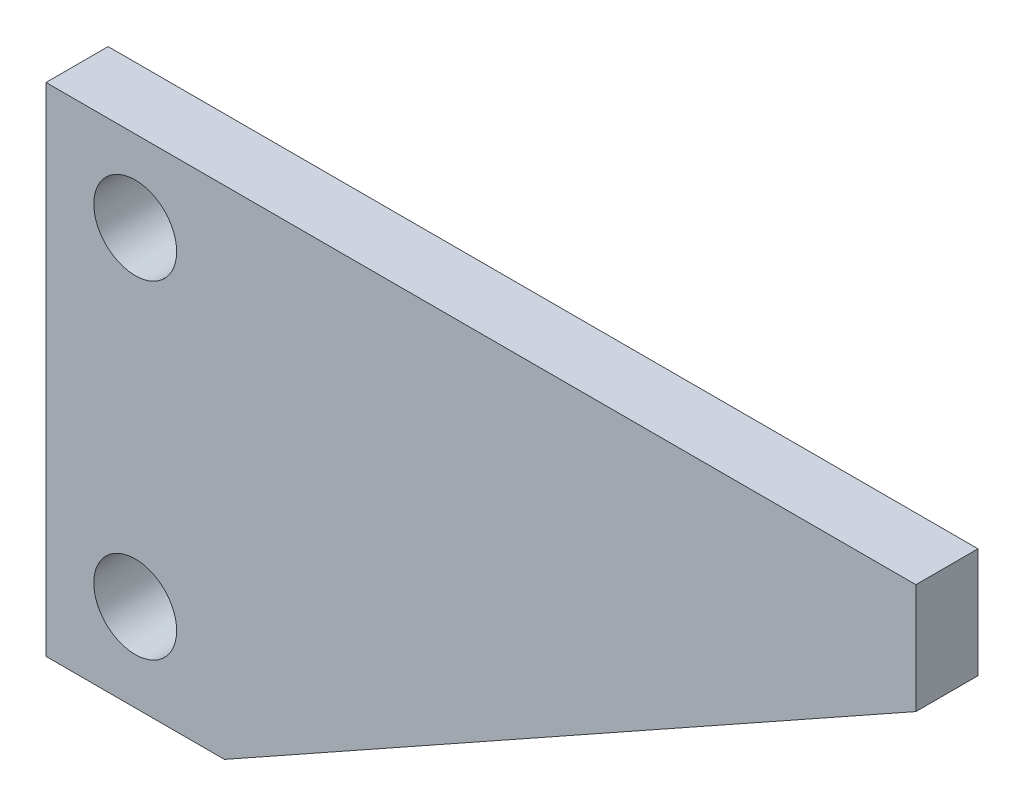
ISO-10303-21;
HEADER;
FILE_DESCRIPTION(('STEP AP214'),'2;1');
FILE_NAME('part.step','',(''),(''),'','','');
FILE_SCHEMA(('AUTOMOTIVE_DESIGN { 1 0 10303 214 1 1 1 1 }'));
ENDSEC;
DATA;
#1=APPLICATION_CONTEXT('core data for automotive mechanical design processes');
#2=APPLICATION_PROTOCOL_DEFINITION('international standard','automotive_design',2000,#1);
#3=PRODUCT_CONTEXT('',#1,'mechanical');
#4=PRODUCT('Part','Part','',(#3));
#5=PRODUCT_RELATED_PRODUCT_CATEGORY('part','',(#4));
#6=PRODUCT_DEFINITION_FORMATION('','',#4);
#7=PRODUCT_DEFINITION_CONTEXT('part definition',#1,'design');
#8=PRODUCT_DEFINITION('design','',#6,#7);
#9=PRODUCT_DEFINITION_SHAPE('','',#8);
#10=(LENGTH_UNIT() NAMED_UNIT(*) SI_UNIT(.MILLI.,.METRE.));
#11=(NAMED_UNIT(*) PLANE_ANGLE_UNIT() SI_UNIT($,.RADIAN.));
#12=(NAMED_UNIT(*) SI_UNIT($,.STERADIAN.) SOLID_ANGLE_UNIT());
#13=UNCERTAINTY_MEASURE_WITH_UNIT(LENGTH_MEASURE(1.E-05),#10,'distance_accuracy_value','');
#14=(GEOMETRIC_REPRESENTATION_CONTEXT(3) GLOBAL_UNCERTAINTY_ASSIGNED_CONTEXT((#13)) GLOBAL_UNIT_ASSIGNED_CONTEXT((#10,
#11,#12)) REPRESENTATION_CONTEXT('',''));
#15=CARTESIAN_POINT('',(0.,0.,0.));
#16=DIRECTION('',(0.,0.,1.));
#17=DIRECTION('',(1.,0.,0.));
#18=AXIS2_PLACEMENT_3D('',#15,#16,#17);
#19=CARTESIAN_POINT('',(0.,0.,12.7));
#20=DIRECTION('',(0.,0.,1.));
#21=DIRECTION('',(1.,0.,0.));
#22=AXIS2_PLACEMENT_3D('',#19,#20,#21);
#23=PLANE('',#22);
#24=CARTESIAN_POINT('',(-47.2179487179487,23.4461538461538,12.7));
#25=DIRECTION('',(0.,0.,1.));
#26=DIRECTION('',(1.,0.,0.));
#27=AXIS2_PLACEMENT_3D('',#24,#25,#26);
#28=CIRCLE('',#27,8.46666666666666);
#29=CARTESIAN_POINT('',(-38.751282051282,23.4461538461538,12.7));
#30=VERTEX_POINT('',#29);
#31=EDGE_CURVE('E135',#30,#30,#28,.T.);
#32=ORIENTED_EDGE('',*,*,#31,.F.);
#33=EDGE_LOOP('',(#32));
#34=FACE_BOUND('',#33,.T.);
#35=DIRECTION('',(-1.,0.,0.));
#36=VECTOR('',#35,1.);
#37=CARTESIAN_POINT('',(112.346153846154,40.0538461538462,12.7));
#38=LINE('',#37,#36);
#39=CARTESIAN_POINT('',(112.346153846154,40.0538461538462,12.7));
#40=VERTEX_POINT('',#39);
#41=CARTESIAN_POINT('',(-65.4538461538461,40.0538461538461,12.7));
#42=VERTEX_POINT('',#41);
#43=EDGE_CURVE('E144',#40,#42,#38,.T.);
#44=ORIENTED_EDGE('',*,*,#43,.T.);
#45=DIRECTION('',(0.,-1.,0.));
#46=VECTOR('',#45,1.);
#47=CARTESIAN_POINT('',(-65.4538461538461,40.0538461538461,12.7));
#48=LINE('',#47,#46);
#49=CARTESIAN_POINT('',(-65.4538461538461,-61.5461538461539,12.7));
#50=VERTEX_POINT('',#49);
#51=EDGE_CURVE('E102',#42,#50,#48,.T.);
#52=ORIENTED_EDGE('',*,*,#51,.T.);
#53=DIRECTION('',(1.,0.,0.));
#54=VECTOR('',#53,1.);
#55=CARTESIAN_POINT('',(-65.4538461538461,-61.5461538461539,12.7));
#56=LINE('',#55,#54);
#57=CARTESIAN_POINT('',(-28.9820512820512,-61.5461538461539,12.7));
#58=VERTEX_POINT('',#57);
#59=EDGE_CURVE('E106',#50,#58,#56,.T.);
#60=ORIENTED_EDGE('',*,*,#59,.T.);
#61=DIRECTION('',(0.872540296945916,0.488542147829165,0.));
#62=VECTOR('',#61,1.);
#63=CARTESIAN_POINT('',(-28.9820512820512,-61.5461538461539,12.7));
#64=LINE('',#63,#62);
#65=CARTESIAN_POINT('',(112.346153846154,17.5846153846154,12.7));
#66=VERTEX_POINT('',#65);
#67=EDGE_CURVE('E110',#58,#66,#64,.T.);
#68=ORIENTED_EDGE('',*,*,#67,.T.);
#69=DIRECTION('',(0.,1.,0.));
#70=VECTOR('',#69,1.);
#71=CARTESIAN_POINT('',(112.346153846154,17.5846153846154,12.7));
#72=LINE('',#71,#70);
#73=EDGE_CURVE('E68',#66,#40,#72,.T.);
#74=ORIENTED_EDGE('',*,*,#73,.T.);
#75=EDGE_LOOP('',(#44,#52,#60,#68,#74));
#76=FACE_BOUND('',#75,.T.);
#77=CARTESIAN_POINT('',(-47.2179487179487,-43.6358974358974,12.7));
#78=DIRECTION('',(0.,0.,1.));
#79=DIRECTION('',(1.,0.,0.));
#80=AXIS2_PLACEMENT_3D('',#77,#78,#79);
#81=CIRCLE('',#80,8.46666666666666);
#82=CARTESIAN_POINT('',(-38.751282051282,-43.6358974358974,12.7));
#83=VERTEX_POINT('',#82);
#84=EDGE_CURVE('E184',#83,#83,#81,.T.);
#85=ORIENTED_EDGE('',*,*,#84,.F.);
#86=EDGE_LOOP('',(#85));
#87=FACE_BOUND('',#86,.T.);
#88=ADVANCED_FACE('F50',(#34,#76,#87),#23,.T.);
#89=CARTESIAN_POINT('',(0.,0.,0.));
#90=DIRECTION('',(0.,0.,1.));
#91=DIRECTION('',(1.,0.,0.));
#92=AXIS2_PLACEMENT_3D('',#89,#90,#91);
#93=PLANE('',#92);
#94=DIRECTION('',(-1.,0.,0.));
#95=VECTOR('',#94,1.);
#96=CARTESIAN_POINT('',(112.346153846154,40.0538461538462,0.));
#97=LINE('',#96,#95);
#98=CARTESIAN_POINT('',(112.346153846154,40.0538461538462,0.));
#99=VERTEX_POINT('',#98);
#100=CARTESIAN_POINT('',(-65.4538461538461,40.0538461538461,0.));
#101=VERTEX_POINT('',#100);
#102=EDGE_CURVE('E130',#99,#101,#97,.T.);
#103=ORIENTED_EDGE('',*,*,#102,.F.);
#104=DIRECTION('',(0.,1.,0.));
#105=VECTOR('',#104,1.);
#106=CARTESIAN_POINT('',(112.346153846154,17.5846153846154,0.));
#107=LINE('',#106,#105);
#108=CARTESIAN_POINT('',(112.346153846154,17.5846153846154,0.));
#109=VERTEX_POINT('',#108);
#110=EDGE_CURVE('E94',#109,#99,#107,.T.);
#111=ORIENTED_EDGE('',*,*,#110,.F.);
#112=DIRECTION('',(0.872540296945916,0.488542147829165,0.));
#113=VECTOR('',#112,1.);
#114=CARTESIAN_POINT('',(-28.9820512820512,-61.5461538461539,0.));
#115=LINE('',#114,#113);
#116=CARTESIAN_POINT('',(-28.9820512820512,-61.5461538461539,0.));
#117=VERTEX_POINT('',#116);
#118=EDGE_CURVE('E88',#117,#109,#115,.T.);
#119=ORIENTED_EDGE('',*,*,#118,.F.);
#120=DIRECTION('',(1.,0.,0.));
#121=VECTOR('',#120,1.);
#122=CARTESIAN_POINT('',(-65.4538461538461,-61.5461538461539,0.));
#123=LINE('',#122,#121);
#124=CARTESIAN_POINT('',(-65.4538461538461,-61.5461538461539,0.));
#125=VERTEX_POINT('',#124);
#126=EDGE_CURVE('E118',#125,#117,#123,.T.);
#127=ORIENTED_EDGE('',*,*,#126,.F.);
#128=DIRECTION('',(0.,-1.,0.));
#129=VECTOR('',#128,1.);
#130=CARTESIAN_POINT('',(-65.4538461538461,40.0538461538461,0.));
#131=LINE('',#130,#129);
#132=EDGE_CURVE('E134',#101,#125,#131,.T.);
#133=ORIENTED_EDGE('',*,*,#132,.F.);
#134=EDGE_LOOP('',(#103,#111,#119,#127,#133));
#135=FACE_BOUND('',#134,.T.);
#136=CARTESIAN_POINT('',(-47.2179487179487,23.4461538461538,0.));
#137=DIRECTION('',(0.,0.,1.));
#138=DIRECTION('',(1.,0.,0.));
#139=AXIS2_PLACEMENT_3D('',#136,#137,#138);
#140=CIRCLE('',#139,8.46666666666666);
#141=CARTESIAN_POINT('',(-38.751282051282,23.4461538461538,0.));
#142=VERTEX_POINT('',#141);
#143=EDGE_CURVE('E192',#142,#142,#140,.T.);
#144=ORIENTED_EDGE('',*,*,#143,.T.);
#145=EDGE_LOOP('',(#144));
#146=FACE_BOUND('',#145,.T.);
#147=CARTESIAN_POINT('',(-47.2179487179487,-43.6358974358974,0.));
#148=DIRECTION('',(0.,0.,1.));
#149=DIRECTION('',(1.,0.,0.));
#150=AXIS2_PLACEMENT_3D('',#147,#148,#149);
#151=CIRCLE('',#150,8.46666666666666);
#152=CARTESIAN_POINT('',(-38.751282051282,-43.6358974358974,0.));
#153=VERTEX_POINT('',#152);
#154=EDGE_CURVE('E187',#153,#153,#151,.T.);
#155=ORIENTED_EDGE('',*,*,#154,.T.);
#156=EDGE_LOOP('',(#155));
#157=FACE_BOUND('',#156,.T.);
#158=ADVANCED_FACE('F151',(#135,#146,#157),#93,.F.);
#159=CARTESIAN_POINT('',(112.346153846154,40.0538461538462,12.7));
#160=DIRECTION('',(0.,-1.,0.));
#161=DIRECTION('',(1.,0.,0.));
#162=AXIS2_PLACEMENT_3D('',#159,#160,#161);
#163=PLANE('',#162);
#164=ORIENTED_EDGE('',*,*,#102,.T.);
#165=DIRECTION('',(0.,0.,-1.));
#166=VECTOR('',#165,1.);
#167=CARTESIAN_POINT('',(-65.4538461538461,40.0538461538461,12.7));
#168=LINE('',#167,#166);
#169=EDGE_CURVE('E12',#42,#101,#168,.T.);
#170=ORIENTED_EDGE('',*,*,#169,.F.);
#171=ORIENTED_EDGE('',*,*,#43,.F.);
#172=DIRECTION('',(0.,0.,-1.));
#173=VECTOR('',#172,1.);
#174=CARTESIAN_POINT('',(112.346153846154,40.0538461538462,12.7));
#175=LINE('',#174,#173);
#176=EDGE_CURVE('E126',#40,#99,#175,.T.);
#177=ORIENTED_EDGE('',*,*,#176,.T.);
#178=EDGE_LOOP('',(#164,#170,#171,#177));
#179=FACE_BOUND('',#178,.T.);
#180=ADVANCED_FACE('F52',(#179),#163,.F.);
#181=CARTESIAN_POINT('',(-65.4538461538461,40.0538461538461,12.7));
#182=DIRECTION('',(1.,0.,0.));
#183=DIRECTION('',(0.,0.,-1.));
#184=AXIS2_PLACEMENT_3D('',#181,#182,#183);
#185=PLANE('',#184);
#186=ORIENTED_EDGE('',*,*,#132,.T.);
#187=DIRECTION('',(0.,0.,-1.));
#188=VECTOR('',#187,1.);
#189=CARTESIAN_POINT('',(-65.4538461538461,-61.5461538461539,12.7));
#190=LINE('',#189,#188);
#191=EDGE_CURVE('E60',#50,#125,#190,.T.);
#192=ORIENTED_EDGE('',*,*,#191,.F.);
#193=ORIENTED_EDGE('',*,*,#51,.F.);
#194=ORIENTED_EDGE('',*,*,#169,.T.);
#195=EDGE_LOOP('',(#186,#192,#193,#194));
#196=FACE_BOUND('',#195,.T.);
#197=ADVANCED_FACE('F238',(#196),#185,.F.);
#198=CARTESIAN_POINT('',(-65.4538461538461,-61.5461538461539,12.7));
#199=DIRECTION('',(0.,1.,0.));
#200=DIRECTION('',(0.,0.,1.));
#201=AXIS2_PLACEMENT_3D('',#198,#199,#200);
#202=PLANE('',#201);
#203=ORIENTED_EDGE('',*,*,#126,.T.);
#204=DIRECTION('',(0.,0.,-1.));
#205=VECTOR('',#204,1.);
#206=CARTESIAN_POINT('',(-28.9820512820512,-61.5461538461539,12.7));
#207=LINE('',#206,#205);
#208=EDGE_CURVE('E115',#58,#117,#207,.T.);
#209=ORIENTED_EDGE('',*,*,#208,.F.);
#210=ORIENTED_EDGE('',*,*,#59,.F.);
#211=ORIENTED_EDGE('',*,*,#191,.T.);
#212=EDGE_LOOP('',(#203,#209,#210,#211));
#213=FACE_BOUND('',#212,.T.);
#214=ADVANCED_FACE('F116',(#213),#202,.F.);
#215=CARTESIAN_POINT('',(-28.9820512820512,-61.5461538461539,12.7));
#216=DIRECTION('',(-0.488542147829165,0.872540296945915,0.));
#217=DIRECTION('',(-0.872540296945915,-0.488542147829165,0.));
#218=AXIS2_PLACEMENT_3D('',#215,#216,#217);
#219=PLANE('',#218);
#220=ORIENTED_EDGE('',*,*,#118,.T.);
#221=DIRECTION('',(0.,0.,-1.));
#222=VECTOR('',#221,1.);
#223=CARTESIAN_POINT('',(112.346153846154,17.5846153846154,12.7));
#224=LINE('',#223,#222);
#225=EDGE_CURVE('E120',#66,#109,#224,.T.);
#226=ORIENTED_EDGE('',*,*,#225,.F.);
#227=ORIENTED_EDGE('',*,*,#67,.F.);
#228=ORIENTED_EDGE('',*,*,#208,.T.);
#229=EDGE_LOOP('',(#220,#226,#227,#228));
#230=FACE_BOUND('',#229,.T.);
#231=ADVANCED_FACE('F122',(#230),#219,.F.);
#232=CARTESIAN_POINT('',(112.346153846154,17.5846153846154,12.7));
#233=DIRECTION('',(-1.,0.,0.));
#234=DIRECTION('',(0.,0.,1.));
#235=AXIS2_PLACEMENT_3D('',#232,#233,#234);
#236=PLANE('',#235);
#237=ORIENTED_EDGE('',*,*,#110,.T.);
#238=ORIENTED_EDGE('',*,*,#176,.F.);
#239=ORIENTED_EDGE('',*,*,#73,.F.);
#240=ORIENTED_EDGE('',*,*,#225,.T.);
#241=EDGE_LOOP('',(#237,#238,#239,#240));
#242=FACE_BOUND('',#241,.T.);
#243=ADVANCED_FACE('F156',(#242),#236,.F.);
#244=CARTESIAN_POINT('',(-47.2179487179487,23.4461538461538,12.7));
#245=DIRECTION('',(0.,0.,-1.));
#246=DIRECTION('',(-1.,0.,0.));
#247=AXIS2_PLACEMENT_3D('',#244,#245,#246);
#248=CYLINDRICAL_SURFACE('',#247,8.46666666666666);
#249=ORIENTED_EDGE('',*,*,#31,.T.);
#250=EDGE_LOOP('',(#249));
#251=FACE_BOUND('',#250,.T.);
#252=ORIENTED_EDGE('',*,*,#143,.F.);
#253=EDGE_LOOP('',(#252));
#254=FACE_BOUND('',#253,.T.);
#255=ADVANCED_FACE('F158',(#251,#254),#248,.F.);
#256=CARTESIAN_POINT('',(-47.2179487179487,-43.6358974358974,12.7));
#257=DIRECTION('',(0.,0.,-1.));
#258=DIRECTION('',(-1.,0.,0.));
#259=AXIS2_PLACEMENT_3D('',#256,#257,#258);
#260=CYLINDRICAL_SURFACE('',#259,8.46666666666666);
#261=ORIENTED_EDGE('',*,*,#84,.T.);
#262=EDGE_LOOP('',(#261));
#263=FACE_BOUND('',#262,.T.);
#264=ORIENTED_EDGE('',*,*,#154,.F.);
#265=EDGE_LOOP('',(#264));
#266=FACE_BOUND('',#265,.T.);
#267=ADVANCED_FACE('F165',(#263,#266),#260,.F.);
#268=CLOSED_SHELL('',(#88,#158,#180,#197,#214,#231,#243,#255,#267));
#269=MANIFOLD_SOLID_BREP('B2',#268);
#270=ADVANCED_BREP_SHAPE_REPRESENTATION('',(#18,#269),#14);
#271=SHAPE_DEFINITION_REPRESENTATION(#9,#270);
ENDSEC;
END-ISO-10303-21;
